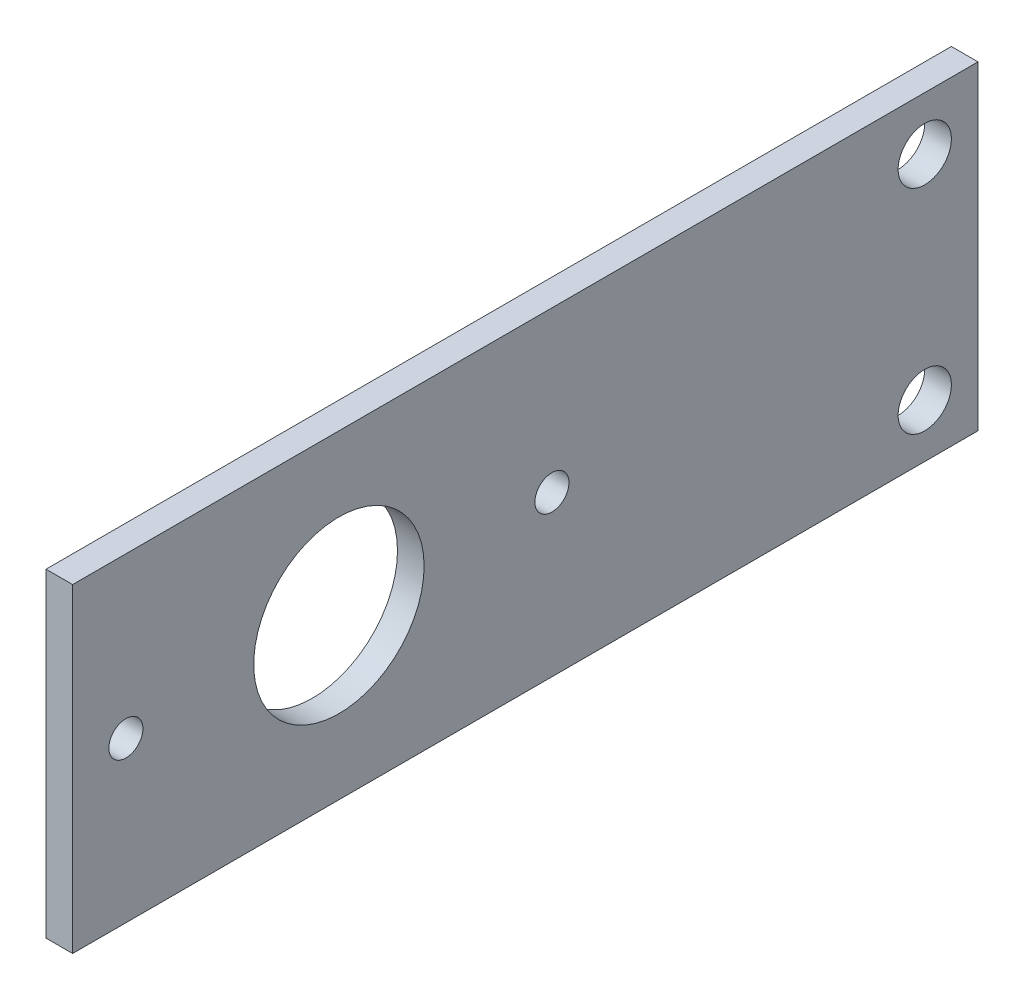
ISO-10303-21;
HEADER;
FILE_DESCRIPTION(('STEP AP214'),'2;1');
FILE_NAME('part.step','',(''),(''),'','','');
FILE_SCHEMA(('AUTOMOTIVE_DESIGN { 1 0 10303 214 1 1 1 1 }'));
ENDSEC;
DATA;
#1=APPLICATION_CONTEXT('core data for automotive mechanical design processes');
#2=APPLICATION_PROTOCOL_DEFINITION('international standard','automotive_design',2000,#1);
#3=PRODUCT_CONTEXT('',#1,'mechanical');
#4=PRODUCT('Part','Part','',(#3));
#5=PRODUCT_RELATED_PRODUCT_CATEGORY('part','',(#4));
#6=PRODUCT_DEFINITION_FORMATION('','',#4);
#7=PRODUCT_DEFINITION_CONTEXT('part definition',#1,'design');
#8=PRODUCT_DEFINITION('design','',#6,#7);
#9=PRODUCT_DEFINITION_SHAPE('','',#8);
#10=(LENGTH_UNIT() NAMED_UNIT(*) SI_UNIT(.MILLI.,.METRE.));
#11=(NAMED_UNIT(*) PLANE_ANGLE_UNIT() SI_UNIT($,.RADIAN.));
#12=(NAMED_UNIT(*) SI_UNIT($,.STERADIAN.) SOLID_ANGLE_UNIT());
#13=UNCERTAINTY_MEASURE_WITH_UNIT(LENGTH_MEASURE(1.E-05),#10,'distance_accuracy_value','');
#14=(GEOMETRIC_REPRESENTATION_CONTEXT(3) GLOBAL_UNCERTAINTY_ASSIGNED_CONTEXT((#13)) GLOBAL_UNIT_ASSIGNED_CONTEXT((#10,
#11,#12)) REPRESENTATION_CONTEXT('',''));
#15=CARTESIAN_POINT('',(0.,0.,0.));
#16=DIRECTION('',(0.,0.,1.));
#17=DIRECTION('',(1.,0.,0.));
#18=AXIS2_PLACEMENT_3D('',#15,#16,#17);
#19=CARTESIAN_POINT('',(3.175,0.,0.));
#20=DIRECTION('',(1.,0.,0.));
#21=DIRECTION('',(0.,0.,-1.));
#22=AXIS2_PLACEMENT_3D('',#19,#20,#21);
#23=PLANE('',#22);
#24=CARTESIAN_POINT('',(3.175,19.05,76.2));
#25=DIRECTION('',(1.,0.,0.));
#26=DIRECTION('',(0.,0.,-1.));
#27=AXIS2_PLACEMENT_3D('',#24,#25,#26);
#28=CIRCLE('',#27,10.16);
#29=CARTESIAN_POINT('',(3.175,19.05,66.04));
#30=VERTEX_POINT('',#29);
#31=EDGE_CURVE('E127',#30,#30,#28,.T.);
#32=ORIENTED_EDGE('',*,*,#31,.F.);
#33=EDGE_LOOP('',(#32));
#34=FACE_BOUND('',#33,.T.);
#35=CARTESIAN_POINT('',(3.175,6.35,6.35));
#36=DIRECTION('',(1.,0.,0.));
#37=DIRECTION('',(0.,0.,-1.));
#38=AXIS2_PLACEMENT_3D('',#35,#36,#37);
#39=CIRCLE('',#38,3.175);
#40=CARTESIAN_POINT('',(3.175,6.35,3.175));
#41=VERTEX_POINT('',#40);
#42=EDGE_CURVE('E115',#41,#41,#39,.T.);
#43=ORIENTED_EDGE('',*,*,#42,.F.);
#44=EDGE_LOOP('',(#43));
#45=FACE_BOUND('',#44,.T.);
#46=DIRECTION('',(0.,1.,0.));
#47=VECTOR('',#46,1.);
#48=CARTESIAN_POINT('',(3.175,0.,0.));
#49=LINE('',#48,#47);
#50=CARTESIAN_POINT('',(3.175,0.,0.));
#51=VERTEX_POINT('',#50);
#52=CARTESIAN_POINT('',(3.175,38.1,0.));
#53=VERTEX_POINT('',#52);
#54=EDGE_CURVE('E85',#51,#53,#49,.T.);
#55=ORIENTED_EDGE('',*,*,#54,.T.);
#56=DIRECTION('',(0.,0.,1.));
#57=VECTOR('',#56,1.);
#58=CARTESIAN_POINT('',(3.175,38.1,0.));
#59=LINE('',#58,#57);
#60=CARTESIAN_POINT('',(3.175,38.1,107.95));
#61=VERTEX_POINT('',#60);
#62=EDGE_CURVE('E80',#53,#61,#59,.T.);
#63=ORIENTED_EDGE('',*,*,#62,.T.);
#64=DIRECTION('',(0.,-1.,0.));
#65=VECTOR('',#64,1.);
#66=CARTESIAN_POINT('',(3.175,0.,107.95));
#67=LINE('',#66,#65);
#68=CARTESIAN_POINT('',(3.175,0.,107.95));
#69=VERTEX_POINT('',#68);
#70=EDGE_CURVE('E83',#61,#69,#67,.T.);
#71=ORIENTED_EDGE('',*,*,#70,.T.);
#72=DIRECTION('',(0.,0.,-1.));
#73=VECTOR('',#72,1.);
#74=CARTESIAN_POINT('',(3.175,0.,0.));
#75=LINE('',#74,#73);
#76=EDGE_CURVE('E50',#69,#51,#75,.T.);
#77=ORIENTED_EDGE('',*,*,#76,.T.);
#78=EDGE_LOOP('',(#55,#63,#71,#77));
#79=FACE_BOUND('',#78,.T.);
#80=CARTESIAN_POINT('',(3.175,31.75,6.35));
#81=DIRECTION('',(1.,0.,0.));
#82=DIRECTION('',(0.,0.,-1.));
#83=AXIS2_PLACEMENT_3D('',#80,#81,#82);
#84=CIRCLE('',#83,3.175);
#85=CARTESIAN_POINT('',(3.175,31.75,3.175));
#86=VERTEX_POINT('',#85);
#87=EDGE_CURVE('E100',#86,#86,#84,.T.);
#88=ORIENTED_EDGE('',*,*,#87,.F.);
#89=EDGE_LOOP('',(#88));
#90=FACE_BOUND('',#89,.T.);
#91=CARTESIAN_POINT('',(3.175,19.05,50.8));
#92=DIRECTION('',(1.,0.,0.));
#93=DIRECTION('',(0.,0.,-1.));
#94=AXIS2_PLACEMENT_3D('',#91,#92,#93);
#95=CIRCLE('',#94,2.032);
#96=CARTESIAN_POINT('',(3.175,19.05,48.768));
#97=VERTEX_POINT('',#96);
#98=EDGE_CURVE('E121',#97,#97,#95,.T.);
#99=ORIENTED_EDGE('',*,*,#98,.F.);
#100=EDGE_LOOP('',(#99));
#101=FACE_BOUND('',#100,.T.);
#102=CARTESIAN_POINT('',(3.175,19.05,101.6));
#103=DIRECTION('',(1.,0.,0.));
#104=DIRECTION('',(0.,0.,-1.));
#105=AXIS2_PLACEMENT_3D('',#102,#103,#104);
#106=CIRCLE('',#105,2.03200000000001);
#107=CARTESIAN_POINT('',(3.175,19.05,99.568));
#108=VERTEX_POINT('',#107);
#109=EDGE_CURVE('E133',#108,#108,#106,.T.);
#110=ORIENTED_EDGE('',*,*,#109,.F.);
#111=EDGE_LOOP('',(#110));
#112=FACE_BOUND('',#111,.T.);
#113=ADVANCED_FACE('F33',(#34,#45,#79,#90,#101,#112),#23,.T.);
#114=CARTESIAN_POINT('',(0.,0.,0.));
#115=DIRECTION('',(1.,0.,0.));
#116=DIRECTION('',(0.,0.,-1.));
#117=AXIS2_PLACEMENT_3D('',#114,#115,#116);
#118=PLANE('',#117);
#119=DIRECTION('',(0.,1.,0.));
#120=VECTOR('',#119,1.);
#121=CARTESIAN_POINT('',(0.,0.,0.));
#122=LINE('',#121,#120);
#123=CARTESIAN_POINT('',(0.,0.,0.));
#124=VERTEX_POINT('',#123);
#125=CARTESIAN_POINT('',(0.,38.1,0.));
#126=VERTEX_POINT('',#125);
#127=EDGE_CURVE('E97',#124,#126,#122,.T.);
#128=ORIENTED_EDGE('',*,*,#127,.F.);
#129=DIRECTION('',(0.,0.,-1.));
#130=VECTOR('',#129,1.);
#131=CARTESIAN_POINT('',(0.,0.,0.));
#132=LINE('',#131,#130);
#133=CARTESIAN_POINT('',(0.,0.,107.95));
#134=VERTEX_POINT('',#133);
#135=EDGE_CURVE('E73',#134,#124,#132,.T.);
#136=ORIENTED_EDGE('',*,*,#135,.F.);
#137=DIRECTION('',(0.,-1.,0.));
#138=VECTOR('',#137,1.);
#139=CARTESIAN_POINT('',(0.,0.,107.95));
#140=LINE('',#139,#138);
#141=CARTESIAN_POINT('',(0.,38.1,107.95));
#142=VERTEX_POINT('',#141);
#143=EDGE_CURVE('E67',#142,#134,#140,.T.);
#144=ORIENTED_EDGE('',*,*,#143,.F.);
#145=DIRECTION('',(0.,0.,1.));
#146=VECTOR('',#145,1.);
#147=CARTESIAN_POINT('',(0.,38.1,0.));
#148=LINE('',#147,#146);
#149=EDGE_CURVE('E89',#126,#142,#148,.T.);
#150=ORIENTED_EDGE('',*,*,#149,.F.);
#151=EDGE_LOOP('',(#128,#136,#144,#150));
#152=FACE_BOUND('',#151,.T.);
#153=CARTESIAN_POINT('',(0.,31.75,6.35));
#154=DIRECTION('',(1.,0.,0.));
#155=DIRECTION('',(0.,0.,-1.));
#156=AXIS2_PLACEMENT_3D('',#153,#154,#155);
#157=CIRCLE('',#156,3.175);
#158=CARTESIAN_POINT('',(0.,31.75,3.175));
#159=VERTEX_POINT('',#158);
#160=EDGE_CURVE('E112',#159,#159,#157,.T.);
#161=ORIENTED_EDGE('',*,*,#160,.T.);
#162=EDGE_LOOP('',(#161));
#163=FACE_BOUND('',#162,.T.);
#164=CARTESIAN_POINT('',(0.,6.35,6.35));
#165=DIRECTION('',(1.,0.,0.));
#166=DIRECTION('',(0.,0.,-1.));
#167=AXIS2_PLACEMENT_3D('',#164,#165,#166);
#168=CIRCLE('',#167,3.175);
#169=CARTESIAN_POINT('',(0.,6.35,3.175));
#170=VERTEX_POINT('',#169);
#171=EDGE_CURVE('E118',#170,#170,#168,.T.);
#172=ORIENTED_EDGE('',*,*,#171,.T.);
#173=EDGE_LOOP('',(#172));
#174=FACE_BOUND('',#173,.T.);
#175=CARTESIAN_POINT('',(0.,19.05,50.8));
#176=DIRECTION('',(1.,0.,0.));
#177=DIRECTION('',(0.,0.,-1.));
#178=AXIS2_PLACEMENT_3D('',#175,#176,#177);
#179=CIRCLE('',#178,2.032);
#180=CARTESIAN_POINT('',(0.,19.05,48.768));
#181=VERTEX_POINT('',#180);
#182=EDGE_CURVE('E124',#181,#181,#179,.T.);
#183=ORIENTED_EDGE('',*,*,#182,.T.);
#184=EDGE_LOOP('',(#183));
#185=FACE_BOUND('',#184,.T.);
#186=CARTESIAN_POINT('',(0.,19.05,76.2));
#187=DIRECTION('',(1.,0.,0.));
#188=DIRECTION('',(0.,0.,-1.));
#189=AXIS2_PLACEMENT_3D('',#186,#187,#188);
#190=CIRCLE('',#189,10.16);
#191=CARTESIAN_POINT('',(0.,19.05,66.04));
#192=VERTEX_POINT('',#191);
#193=EDGE_CURVE('E130',#192,#192,#190,.T.);
#194=ORIENTED_EDGE('',*,*,#193,.T.);
#195=EDGE_LOOP('',(#194));
#196=FACE_BOUND('',#195,.T.);
#197=CARTESIAN_POINT('',(0.,19.05,101.6));
#198=DIRECTION('',(1.,0.,0.));
#199=DIRECTION('',(0.,0.,-1.));
#200=AXIS2_PLACEMENT_3D('',#197,#198,#199);
#201=CIRCLE('',#200,2.03200000000001);
#202=CARTESIAN_POINT('',(0.,19.05,99.568));
#203=VERTEX_POINT('',#202);
#204=EDGE_CURVE('E136',#203,#203,#201,.T.);
#205=ORIENTED_EDGE('',*,*,#204,.T.);
#206=EDGE_LOOP('',(#205));
#207=FACE_BOUND('',#206,.T.);
#208=ADVANCED_FACE('F108',(#152,#163,#174,#185,#196,#207),#118,.F.);
#209=CARTESIAN_POINT('',(3.175,0.,0.));
#210=DIRECTION('',(0.,0.,1.));
#211=DIRECTION('',(1.,0.,0.));
#212=AXIS2_PLACEMENT_3D('',#209,#210,#211);
#213=PLANE('',#212);
#214=ORIENTED_EDGE('',*,*,#127,.T.);
#215=DIRECTION('',(-1.,0.,0.));
#216=VECTOR('',#215,1.);
#217=CARTESIAN_POINT('',(3.175,38.1,0.));
#218=LINE('',#217,#216);
#219=EDGE_CURVE('E11',#53,#126,#218,.T.);
#220=ORIENTED_EDGE('',*,*,#219,.F.);
#221=ORIENTED_EDGE('',*,*,#54,.F.);
#222=DIRECTION('',(-1.,0.,0.));
#223=VECTOR('',#222,1.);
#224=CARTESIAN_POINT('',(3.175,0.,0.));
#225=LINE('',#224,#223);
#226=EDGE_CURVE('E93',#51,#124,#225,.T.);
#227=ORIENTED_EDGE('',*,*,#226,.T.);
#228=EDGE_LOOP('',(#214,#220,#221,#227));
#229=FACE_BOUND('',#228,.T.);
#230=ADVANCED_FACE('F35',(#229),#213,.F.);
#231=CARTESIAN_POINT('',(3.175,38.1,0.));
#232=DIRECTION('',(0.,-1.,0.));
#233=DIRECTION('',(0.,0.,-1.));
#234=AXIS2_PLACEMENT_3D('',#231,#232,#233);
#235=PLANE('',#234);
#236=ORIENTED_EDGE('',*,*,#149,.T.);
#237=DIRECTION('',(-1.,0.,0.));
#238=VECTOR('',#237,1.);
#239=CARTESIAN_POINT('',(3.175,38.1,107.95));
#240=LINE('',#239,#238);
#241=EDGE_CURVE('E42',#61,#142,#240,.T.);
#242=ORIENTED_EDGE('',*,*,#241,.F.);
#243=ORIENTED_EDGE('',*,*,#62,.F.);
#244=ORIENTED_EDGE('',*,*,#219,.T.);
#245=EDGE_LOOP('',(#236,#242,#243,#244));
#246=FACE_BOUND('',#245,.T.);
#247=ADVANCED_FACE('F88',(#246),#235,.F.);
#248=CARTESIAN_POINT('',(3.175,0.,107.95));
#249=DIRECTION('',(0.,0.,-1.));
#250=DIRECTION('',(-1.,0.,0.));
#251=AXIS2_PLACEMENT_3D('',#248,#249,#250);
#252=PLANE('',#251);
#253=ORIENTED_EDGE('',*,*,#143,.T.);
#254=DIRECTION('',(-1.,0.,0.));
#255=VECTOR('',#254,1.);
#256=CARTESIAN_POINT('',(3.175,0.,107.95));
#257=LINE('',#256,#255);
#258=EDGE_CURVE('E90',#69,#134,#257,.T.);
#259=ORIENTED_EDGE('',*,*,#258,.F.);
#260=ORIENTED_EDGE('',*,*,#70,.F.);
#261=ORIENTED_EDGE('',*,*,#241,.T.);
#262=EDGE_LOOP('',(#253,#259,#260,#261));
#263=FACE_BOUND('',#262,.T.);
#264=ADVANCED_FACE('F91',(#263),#252,.F.);
#265=CARTESIAN_POINT('',(3.175,0.,0.));
#266=DIRECTION('',(0.,1.,0.));
#267=DIRECTION('',(0.,0.,1.));
#268=AXIS2_PLACEMENT_3D('',#265,#266,#267);
#269=PLANE('',#268);
#270=ORIENTED_EDGE('',*,*,#135,.T.);
#271=ORIENTED_EDGE('',*,*,#226,.F.);
#272=ORIENTED_EDGE('',*,*,#76,.F.);
#273=ORIENTED_EDGE('',*,*,#258,.T.);
#274=EDGE_LOOP('',(#270,#271,#272,#273));
#275=FACE_BOUND('',#274,.T.);
#276=ADVANCED_FACE('F105',(#275),#269,.F.);
#277=CARTESIAN_POINT('',(3.175,31.75,6.35));
#278=DIRECTION('',(-1.,0.,0.));
#279=DIRECTION('',(0.,0.,1.));
#280=AXIS2_PLACEMENT_3D('',#277,#278,#279);
#281=CYLINDRICAL_SURFACE('',#280,3.175);
#282=ORIENTED_EDGE('',*,*,#87,.T.);
#283=EDGE_LOOP('',(#282));
#284=FACE_BOUND('',#283,.T.);
#285=ORIENTED_EDGE('',*,*,#160,.F.);
#286=EDGE_LOOP('',(#285));
#287=FACE_BOUND('',#286,.T.);
#288=ADVANCED_FACE('F155',(#284,#287),#281,.F.);
#289=CARTESIAN_POINT('',(3.175,6.35,6.35));
#290=DIRECTION('',(-1.,0.,0.));
#291=DIRECTION('',(0.,0.,1.));
#292=AXIS2_PLACEMENT_3D('',#289,#290,#291);
#293=CYLINDRICAL_SURFACE('',#292,3.175);
#294=ORIENTED_EDGE('',*,*,#42,.T.);
#295=EDGE_LOOP('',(#294));
#296=FACE_BOUND('',#295,.T.);
#297=ORIENTED_EDGE('',*,*,#171,.F.);
#298=EDGE_LOOP('',(#297));
#299=FACE_BOUND('',#298,.T.);
#300=ADVANCED_FACE('F201',(#296,#299),#293,.F.);
#301=CARTESIAN_POINT('',(3.175,19.05,50.8));
#302=DIRECTION('',(-1.,0.,0.));
#303=DIRECTION('',(0.,0.,1.));
#304=AXIS2_PLACEMENT_3D('',#301,#302,#303);
#305=CYLINDRICAL_SURFACE('',#304,2.032);
#306=ORIENTED_EDGE('',*,*,#98,.T.);
#307=EDGE_LOOP('',(#306));
#308=FACE_BOUND('',#307,.T.);
#309=ORIENTED_EDGE('',*,*,#182,.F.);
#310=EDGE_LOOP('',(#309));
#311=FACE_BOUND('',#310,.T.);
#312=ADVANCED_FACE('F209',(#308,#311),#305,.F.);
#313=CARTESIAN_POINT('',(3.175,19.05,76.2));
#314=DIRECTION('',(-1.,0.,0.));
#315=DIRECTION('',(0.,0.,1.));
#316=AXIS2_PLACEMENT_3D('',#313,#314,#315);
#317=CYLINDRICAL_SURFACE('',#316,10.16);
#318=ORIENTED_EDGE('',*,*,#31,.T.);
#319=EDGE_LOOP('',(#318));
#320=FACE_BOUND('',#319,.T.);
#321=ORIENTED_EDGE('',*,*,#193,.F.);
#322=EDGE_LOOP('',(#321));
#323=FACE_BOUND('',#322,.T.);
#324=ADVANCED_FACE('F217',(#320,#323),#317,.F.);
#325=CARTESIAN_POINT('',(3.175,19.05,101.6));
#326=DIRECTION('',(-1.,0.,0.));
#327=DIRECTION('',(0.,0.,1.));
#328=AXIS2_PLACEMENT_3D('',#325,#326,#327);
#329=CYLINDRICAL_SURFACE('',#328,2.03200000000001);
#330=ORIENTED_EDGE('',*,*,#109,.T.);
#331=EDGE_LOOP('',(#330));
#332=FACE_BOUND('',#331,.T.);
#333=ORIENTED_EDGE('',*,*,#204,.F.);
#334=EDGE_LOOP('',(#333));
#335=FACE_BOUND('',#334,.T.);
#336=ADVANCED_FACE('F142',(#332,#335),#329,.F.);
#337=CLOSED_SHELL('',(#113,#208,#230,#247,#264,#276,#288,#300,#312,#324,#336));
#338=MANIFOLD_SOLID_BREP('B2',#337);
#339=ADVANCED_BREP_SHAPE_REPRESENTATION('',(#18,#338),#14);
#340=SHAPE_DEFINITION_REPRESENTATION(#9,#339);
ENDSEC;
END-ISO-10303-21;
